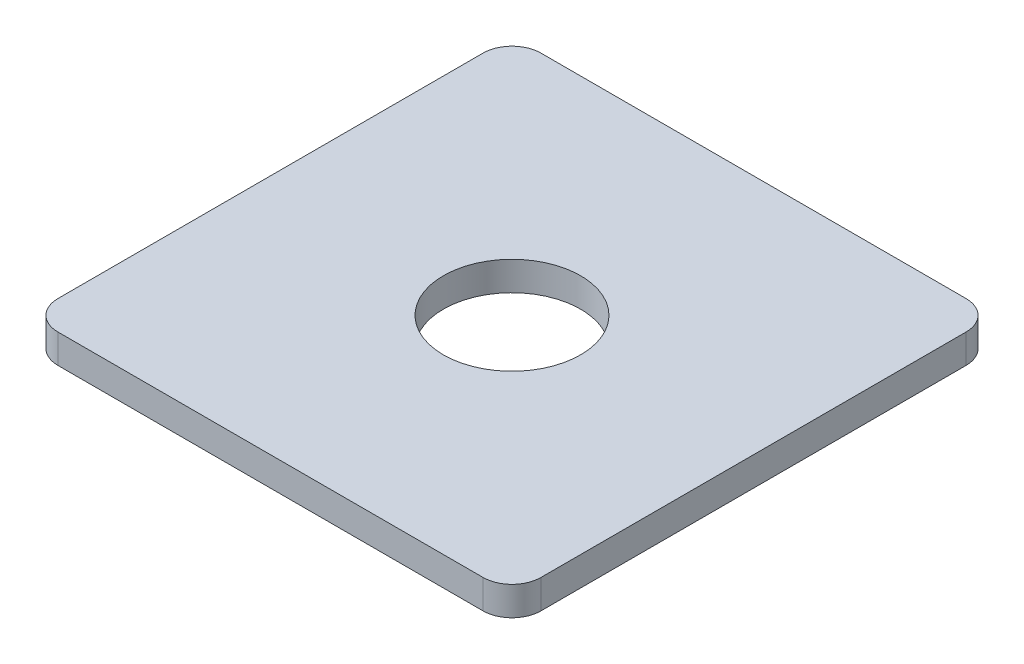
ISO-10303-21;
HEADER;
FILE_DESCRIPTION(('STEP AP214'),'2;1');
FILE_NAME('part.step','',(''),(''),'','','');
FILE_SCHEMA(('AUTOMOTIVE_DESIGN { 1 0 10303 214 1 1 1 1 }'));
ENDSEC;
DATA;
#1=APPLICATION_CONTEXT('core data for automotive mechanical design processes');
#2=APPLICATION_PROTOCOL_DEFINITION('international standard','automotive_design',2000,#1);
#3=PRODUCT_CONTEXT('',#1,'mechanical');
#4=PRODUCT('Part','Part','',(#3));
#5=PRODUCT_RELATED_PRODUCT_CATEGORY('part','',(#4));
#6=PRODUCT_DEFINITION_FORMATION('','',#4);
#7=PRODUCT_DEFINITION_CONTEXT('part definition',#1,'design');
#8=PRODUCT_DEFINITION('design','',#6,#7);
#9=PRODUCT_DEFINITION_SHAPE('','',#8);
#10=(LENGTH_UNIT() NAMED_UNIT(*) SI_UNIT(.MILLI.,.METRE.));
#11=(NAMED_UNIT(*) PLANE_ANGLE_UNIT() SI_UNIT($,.RADIAN.));
#12=(NAMED_UNIT(*) SI_UNIT($,.STERADIAN.) SOLID_ANGLE_UNIT());
#13=UNCERTAINTY_MEASURE_WITH_UNIT(LENGTH_MEASURE(1.E-05),#10,'distance_accuracy_value','');
#14=(GEOMETRIC_REPRESENTATION_CONTEXT(3) GLOBAL_UNCERTAINTY_ASSIGNED_CONTEXT((#13)) GLOBAL_UNIT_ASSIGNED_CONTEXT((#10,
#11,#12)) REPRESENTATION_CONTEXT('',''));
#15=CARTESIAN_POINT('',(0.,0.,0.));
#16=DIRECTION('',(0.,0.,1.));
#17=DIRECTION('',(1.,0.,0.));
#18=AXIS2_PLACEMENT_3D('',#15,#16,#17);
#19=CARTESIAN_POINT('',(0.,3.,50.));
#20=DIRECTION('',(1.,0.,0.));
#21=DIRECTION('',(0.,0.,-1.));
#22=AXIS2_PLACEMENT_3D('',#19,#20,#21);
#23=PLANE('',#22);
#24=DIRECTION('',(0.,0.,-1.));
#25=VECTOR('',#24,1.);
#26=CARTESIAN_POINT('',(0.,3.,50.));
#27=LINE('',#26,#25);
#28=CARTESIAN_POINT('',(0.,3.,47.));
#29=VERTEX_POINT('',#28);
#30=CARTESIAN_POINT('',(0.,3.,3.));
#31=VERTEX_POINT('',#30);
#32=EDGE_CURVE('E160',#29,#31,#27,.T.);
#33=ORIENTED_EDGE('',*,*,#32,.T.);
#34=DIRECTION('',(0.,-1.,0.));
#35=VECTOR('',#34,1.);
#36=CARTESIAN_POINT('',(0.,3.,3.));
#37=LINE('',#36,#35);
#38=CARTESIAN_POINT('',(0.,0.,3.));
#39=VERTEX_POINT('',#38);
#40=EDGE_CURVE('E124',#31,#39,#37,.T.);
#41=ORIENTED_EDGE('',*,*,#40,.T.);
#42=DIRECTION('',(0.,0.,-1.));
#43=VECTOR('',#42,1.);
#44=CARTESIAN_POINT('',(0.,0.,50.));
#45=LINE('',#44,#43);
#46=CARTESIAN_POINT('',(0.,0.,47.));
#47=VERTEX_POINT('',#46);
#48=EDGE_CURVE('E109',#47,#39,#45,.T.);
#49=ORIENTED_EDGE('',*,*,#48,.F.);
#50=DIRECTION('',(0.,-1.,0.));
#51=VECTOR('',#50,1.);
#52=CARTESIAN_POINT('',(0.,3.,47.));
#53=LINE('',#52,#51);
#54=EDGE_CURVE('E121',#47,#29,#53,.F.);
#55=ORIENTED_EDGE('',*,*,#54,.T.);
#56=EDGE_LOOP('',(#33,#41,#49,#55));
#57=FACE_BOUND('',#56,.T.);
#58=ADVANCED_FACE('F39',(#57),#23,.F.);
#59=CARTESIAN_POINT('',(0.,0.,50.));
#60=DIRECTION('',(0.,1.,0.));
#61=DIRECTION('',(0.,0.,1.));
#62=AXIS2_PLACEMENT_3D('',#59,#60,#61);
#63=PLANE('',#62);
#64=CARTESIAN_POINT('',(25.,0.,25.));
#65=DIRECTION('',(0.,1.,0.));
#66=DIRECTION('',(0.,0.,1.));
#67=AXIS2_PLACEMENT_3D('',#64,#65,#66);
#68=CIRCLE('',#67,7.1);
#69=CARTESIAN_POINT('',(25.,0.,32.1));
#70=VERTEX_POINT('',#69);
#71=EDGE_CURVE('E171',#70,#70,#68,.T.);
#72=ORIENTED_EDGE('',*,*,#71,.T.);
#73=EDGE_LOOP('',(#72));
#74=FACE_BOUND('',#73,.T.);
#75=ORIENTED_EDGE('',*,*,#48,.T.);
#76=CARTESIAN_POINT('',(3.,0.,3.));
#77=DIRECTION('',(0.,1.,0.));
#78=DIRECTION('',(0.,0.,1.));
#79=AXIS2_PLACEMENT_3D('',#76,#77,#78);
#80=CIRCLE('',#79,3.);
#81=CARTESIAN_POINT('',(3.,0.,0.));
#82=VERTEX_POINT('',#81);
#83=EDGE_CURVE('E136',#39,#82,#80,.F.);
#84=ORIENTED_EDGE('',*,*,#83,.T.);
#85=DIRECTION('',(1.,0.,0.));
#86=VECTOR('',#85,1.);
#87=CARTESIAN_POINT('',(0.,0.,0.));
#88=LINE('',#87,#86);
#89=CARTESIAN_POINT('',(47.,0.,0.));
#90=VERTEX_POINT('',#89);
#91=EDGE_CURVE('E168',#82,#90,#88,.T.);
#92=ORIENTED_EDGE('',*,*,#91,.T.);
#93=CARTESIAN_POINT('',(47.,0.,3.));
#94=DIRECTION('',(0.,1.,0.));
#95=DIRECTION('',(0.,0.,1.));
#96=AXIS2_PLACEMENT_3D('',#93,#94,#95);
#97=CIRCLE('',#96,3.);
#98=CARTESIAN_POINT('',(50.,0.,3.));
#99=VERTEX_POINT('',#98);
#100=EDGE_CURVE('E115',#90,#99,#97,.F.);
#101=ORIENTED_EDGE('',*,*,#100,.T.);
#102=DIRECTION('',(0.,0.,-1.));
#103=VECTOR('',#102,1.);
#104=CARTESIAN_POINT('',(50.,0.,50.));
#105=LINE('',#104,#103);
#106=CARTESIAN_POINT('',(50.,0.,47.));
#107=VERTEX_POINT('',#106);
#108=EDGE_CURVE('E125',#107,#99,#105,.T.);
#109=ORIENTED_EDGE('',*,*,#108,.F.);
#110=CARTESIAN_POINT('',(47.,0.,47.));
#111=DIRECTION('',(0.,1.,0.));
#112=DIRECTION('',(0.,0.,1.));
#113=AXIS2_PLACEMENT_3D('',#110,#111,#112);
#114=CIRCLE('',#113,3.);
#115=CARTESIAN_POINT('',(47.,0.,50.));
#116=VERTEX_POINT('',#115);
#117=EDGE_CURVE('E116',#107,#116,#114,.F.);
#118=ORIENTED_EDGE('',*,*,#117,.T.);
#119=DIRECTION('',(1.,0.,0.));
#120=VECTOR('',#119,1.);
#121=CARTESIAN_POINT('',(0.,0.,50.));
#122=LINE('',#121,#120);
#123=CARTESIAN_POINT('',(3.,0.,50.));
#124=VERTEX_POINT('',#123);
#125=EDGE_CURVE('E111',#124,#116,#122,.T.);
#126=ORIENTED_EDGE('',*,*,#125,.F.);
#127=CARTESIAN_POINT('',(3.,0.,47.));
#128=DIRECTION('',(0.,1.,0.));
#129=DIRECTION('',(0.,0.,1.));
#130=AXIS2_PLACEMENT_3D('',#127,#128,#129);
#131=CIRCLE('',#130,3.);
#132=EDGE_CURVE('E106',#124,#47,#131,.F.);
#133=ORIENTED_EDGE('',*,*,#132,.T.);
#134=EDGE_LOOP('',(#75,#84,#92,#101,#109,#118,#126,#133));
#135=FACE_BOUND('',#134,.T.);
#136=ADVANCED_FACE('F108',(#74,#135),#63,.F.);
#137=CARTESIAN_POINT('',(50.,0.,50.));
#138=DIRECTION('',(-1.,0.,0.));
#139=DIRECTION('',(0.,0.,1.));
#140=AXIS2_PLACEMENT_3D('',#137,#138,#139);
#141=PLANE('',#140);
#142=ORIENTED_EDGE('',*,*,#108,.T.);
#143=DIRECTION('',(0.,1.,0.));
#144=VECTOR('',#143,1.);
#145=CARTESIAN_POINT('',(50.,0.,3.));
#146=LINE('',#145,#144);
#147=CARTESIAN_POINT('',(50.,3.,3.));
#148=VERTEX_POINT('',#147);
#149=EDGE_CURVE('E149',#99,#148,#146,.T.);
#150=ORIENTED_EDGE('',*,*,#149,.T.);
#151=DIRECTION('',(0.,0.,-1.));
#152=VECTOR('',#151,1.);
#153=CARTESIAN_POINT('',(50.,3.,50.));
#154=LINE('',#153,#152);
#155=CARTESIAN_POINT('',(50.,3.,47.));
#156=VERTEX_POINT('',#155);
#157=EDGE_CURVE('E162',#156,#148,#154,.T.);
#158=ORIENTED_EDGE('',*,*,#157,.F.);
#159=DIRECTION('',(0.,1.,0.));
#160=VECTOR('',#159,1.);
#161=CARTESIAN_POINT('',(50.,0.,47.));
#162=LINE('',#161,#160);
#163=EDGE_CURVE('E147',#156,#107,#162,.F.);
#164=ORIENTED_EDGE('',*,*,#163,.T.);
#165=EDGE_LOOP('',(#142,#150,#158,#164));
#166=FACE_BOUND('',#165,.T.);
#167=ADVANCED_FACE('F176',(#166),#141,.F.);
#168=CARTESIAN_POINT('',(50.,3.,50.));
#169=DIRECTION('',(0.,-1.,0.));
#170=DIRECTION('',(0.,0.,-1.));
#171=AXIS2_PLACEMENT_3D('',#168,#169,#170);
#172=PLANE('',#171);
#173=CARTESIAN_POINT('',(25.,3.,25.));
#174=DIRECTION('',(0.,1.,0.));
#175=DIRECTION('',(0.,0.,1.));
#176=AXIS2_PLACEMENT_3D('',#173,#174,#175);
#177=CIRCLE('',#176,7.1);
#178=CARTESIAN_POINT('',(25.,3.,32.1));
#179=VERTEX_POINT('',#178);
#180=EDGE_CURVE('E302',#179,#179,#177,.T.);
#181=ORIENTED_EDGE('',*,*,#180,.F.);
#182=EDGE_LOOP('',(#181));
#183=FACE_BOUND('',#182,.T.);
#184=DIRECTION('',(-1.,0.,0.));
#185=VECTOR('',#184,1.);
#186=CARTESIAN_POINT('',(50.,3.,0.));
#187=LINE('',#186,#185);
#188=CARTESIAN_POINT('',(47.,3.,0.));
#189=VERTEX_POINT('',#188);
#190=CARTESIAN_POINT('',(3.,3.,0.));
#191=VERTEX_POINT('',#190);
#192=EDGE_CURVE('E164',#189,#191,#187,.T.);
#193=ORIENTED_EDGE('',*,*,#192,.T.);
#194=CARTESIAN_POINT('',(3.,3.,3.));
#195=DIRECTION('',(0.,-1.,0.));
#196=DIRECTION('',(0.,0.,-1.));
#197=AXIS2_PLACEMENT_3D('',#194,#195,#196);
#198=CIRCLE('',#197,3.);
#199=EDGE_CURVE('E145',#191,#31,#198,.F.);
#200=ORIENTED_EDGE('',*,*,#199,.T.);
#201=ORIENTED_EDGE('',*,*,#32,.F.);
#202=CARTESIAN_POINT('',(3.,3.,47.));
#203=DIRECTION('',(0.,-1.,0.));
#204=DIRECTION('',(0.,0.,-1.));
#205=AXIS2_PLACEMENT_3D('',#202,#203,#204);
#206=CIRCLE('',#205,3.);
#207=CARTESIAN_POINT('',(3.,3.,50.));
#208=VERTEX_POINT('',#207);
#209=EDGE_CURVE('E129',#29,#208,#206,.F.);
#210=ORIENTED_EDGE('',*,*,#209,.T.);
#211=DIRECTION('',(-1.,0.,0.));
#212=VECTOR('',#211,1.);
#213=CARTESIAN_POINT('',(50.,3.,50.));
#214=LINE('',#213,#212);
#215=CARTESIAN_POINT('',(47.,3.,50.));
#216=VERTEX_POINT('',#215);
#217=EDGE_CURVE('E155',#216,#208,#214,.T.);
#218=ORIENTED_EDGE('',*,*,#217,.F.);
#219=CARTESIAN_POINT('',(47.,3.,47.));
#220=DIRECTION('',(0.,-1.,0.));
#221=DIRECTION('',(0.,0.,-1.));
#222=AXIS2_PLACEMENT_3D('',#219,#220,#221);
#223=CIRCLE('',#222,3.);
#224=EDGE_CURVE('E62',#216,#156,#223,.F.);
#225=ORIENTED_EDGE('',*,*,#224,.T.);
#226=ORIENTED_EDGE('',*,*,#157,.T.);
#227=CARTESIAN_POINT('',(47.,3.,3.));
#228=DIRECTION('',(0.,-1.,0.));
#229=DIRECTION('',(0.,0.,-1.));
#230=AXIS2_PLACEMENT_3D('',#227,#228,#229);
#231=CIRCLE('',#230,3.);
#232=EDGE_CURVE('E54',#148,#189,#231,.F.);
#233=ORIENTED_EDGE('',*,*,#232,.T.);
#234=EDGE_LOOP('',(#193,#200,#201,#210,#218,#225,#226,#233));
#235=FACE_BOUND('',#234,.T.);
#236=ADVANCED_FACE('F159',(#183,#235),#172,.F.);
#237=CARTESIAN_POINT('',(0.,0.,50.));
#238=DIRECTION('',(0.,0.,1.));
#239=DIRECTION('',(1.,0.,0.));
#240=AXIS2_PLACEMENT_3D('',#237,#238,#239);
#241=PLANE('',#240);
#242=ORIENTED_EDGE('',*,*,#217,.T.);
#243=DIRECTION('',(0.,-1.,0.));
#244=VECTOR('',#243,1.);
#245=CARTESIAN_POINT('',(3.,0.,50.));
#246=LINE('',#245,#244);
#247=EDGE_CURVE('E11',#208,#124,#246,.T.);
#248=ORIENTED_EDGE('',*,*,#247,.T.);
#249=ORIENTED_EDGE('',*,*,#125,.T.);
#250=DIRECTION('',(0.,1.,0.));
#251=VECTOR('',#250,1.);
#252=CARTESIAN_POINT('',(47.,3.,50.));
#253=LINE('',#252,#251);
#254=EDGE_CURVE('E47',#116,#216,#253,.T.);
#255=ORIENTED_EDGE('',*,*,#254,.T.);
#256=EDGE_LOOP('',(#242,#248,#249,#255));
#257=FACE_BOUND('',#256,.T.);
#258=ADVANCED_FACE('F154',(#257),#241,.T.);
#259=CARTESIAN_POINT('',(0.,0.,0.));
#260=DIRECTION('',(0.,0.,1.));
#261=DIRECTION('',(1.,0.,0.));
#262=AXIS2_PLACEMENT_3D('',#259,#260,#261);
#263=PLANE('',#262);
#264=ORIENTED_EDGE('',*,*,#91,.F.);
#265=DIRECTION('',(0.,-1.,0.));
#266=VECTOR('',#265,1.);
#267=CARTESIAN_POINT('',(3.,0.,0.));
#268=LINE('',#267,#266);
#269=EDGE_CURVE('E140',#82,#191,#268,.F.);
#270=ORIENTED_EDGE('',*,*,#269,.T.);
#271=ORIENTED_EDGE('',*,*,#192,.F.);
#272=DIRECTION('',(0.,1.,0.));
#273=VECTOR('',#272,1.);
#274=CARTESIAN_POINT('',(47.,0.,0.));
#275=LINE('',#274,#273);
#276=EDGE_CURVE('E138',#189,#90,#275,.F.);
#277=ORIENTED_EDGE('',*,*,#276,.T.);
#278=EDGE_LOOP('',(#264,#270,#271,#277));
#279=FACE_BOUND('',#278,.T.);
#280=ADVANCED_FACE('F183',(#279),#263,.F.);
#281=CARTESIAN_POINT('',(3.,3.,3.));
#282=DIRECTION('',(0.,-1.,0.));
#283=DIRECTION('',(0.,0.,-1.));
#284=AXIS2_PLACEMENT_3D('',#281,#282,#283);
#285=CYLINDRICAL_SURFACE('',#284,3.);
#286=ORIENTED_EDGE('',*,*,#199,.F.);
#287=ORIENTED_EDGE('',*,*,#269,.F.);
#288=ORIENTED_EDGE('',*,*,#83,.F.);
#289=ORIENTED_EDGE('',*,*,#40,.F.);
#290=EDGE_LOOP('',(#286,#287,#288,#289));
#291=FACE_BOUND('',#290,.T.);
#292=ADVANCED_FACE('F187',(#291),#285,.T.);
#293=CARTESIAN_POINT('',(47.,0.,3.));
#294=DIRECTION('',(0.,1.,0.));
#295=DIRECTION('',(0.,0.,1.));
#296=AXIS2_PLACEMENT_3D('',#293,#294,#295);
#297=CYLINDRICAL_SURFACE('',#296,3.);
#298=ORIENTED_EDGE('',*,*,#100,.F.);
#299=ORIENTED_EDGE('',*,*,#276,.F.);
#300=ORIENTED_EDGE('',*,*,#232,.F.);
#301=ORIENTED_EDGE('',*,*,#149,.F.);
#302=EDGE_LOOP('',(#298,#299,#300,#301));
#303=FACE_BOUND('',#302,.T.);
#304=ADVANCED_FACE('F179',(#303),#297,.T.);
#305=CARTESIAN_POINT('',(3.,0.,47.));
#306=DIRECTION('',(0.,1.,0.));
#307=DIRECTION('',(0.,0.,1.));
#308=AXIS2_PLACEMENT_3D('',#305,#306,#307);
#309=CYLINDRICAL_SURFACE('',#308,3.);
#310=ORIENTED_EDGE('',*,*,#209,.F.);
#311=ORIENTED_EDGE('',*,*,#54,.F.);
#312=ORIENTED_EDGE('',*,*,#132,.F.);
#313=ORIENTED_EDGE('',*,*,#247,.F.);
#314=EDGE_LOOP('',(#310,#311,#312,#313));
#315=FACE_BOUND('',#314,.T.);
#316=ADVANCED_FACE('F128',(#315),#309,.T.);
#317=CARTESIAN_POINT('',(47.,0.,47.));
#318=DIRECTION('',(0.,-1.,0.));
#319=DIRECTION('',(0.,0.,-1.));
#320=AXIS2_PLACEMENT_3D('',#317,#318,#319);
#321=CYLINDRICAL_SURFACE('',#320,3.);
#322=ORIENTED_EDGE('',*,*,#117,.F.);
#323=ORIENTED_EDGE('',*,*,#163,.F.);
#324=ORIENTED_EDGE('',*,*,#224,.F.);
#325=ORIENTED_EDGE('',*,*,#254,.F.);
#326=EDGE_LOOP('',(#322,#323,#324,#325));
#327=FACE_BOUND('',#326,.T.);
#328=ADVANCED_FACE('F41',(#327),#321,.T.);
#329=CARTESIAN_POINT('',(25.,0.,25.));
#330=DIRECTION('',(0.,1.,0.));
#331=DIRECTION('',(0.,0.,1.));
#332=AXIS2_PLACEMENT_3D('',#329,#330,#331);
#333=CYLINDRICAL_SURFACE('',#332,7.1);
#334=ORIENTED_EDGE('',*,*,#71,.F.);
#335=EDGE_LOOP('',(#334));
#336=FACE_BOUND('',#335,.T.);
#337=ORIENTED_EDGE('',*,*,#180,.T.);
#338=EDGE_LOOP('',(#337));
#339=FACE_BOUND('',#338,.T.);
#340=ADVANCED_FACE('F189',(#336,#339),#333,.F.);
#341=CLOSED_SHELL('',(#58,#136,#167,#236,#258,#280,#292,#304,#316,#328,#340));
#342=MANIFOLD_SOLID_BREP('B2',#341);
#343=ADVANCED_BREP_SHAPE_REPRESENTATION('',(#18,#342),#14);
#344=SHAPE_DEFINITION_REPRESENTATION(#9,#343);
ENDSEC;
END-ISO-10303-21;
